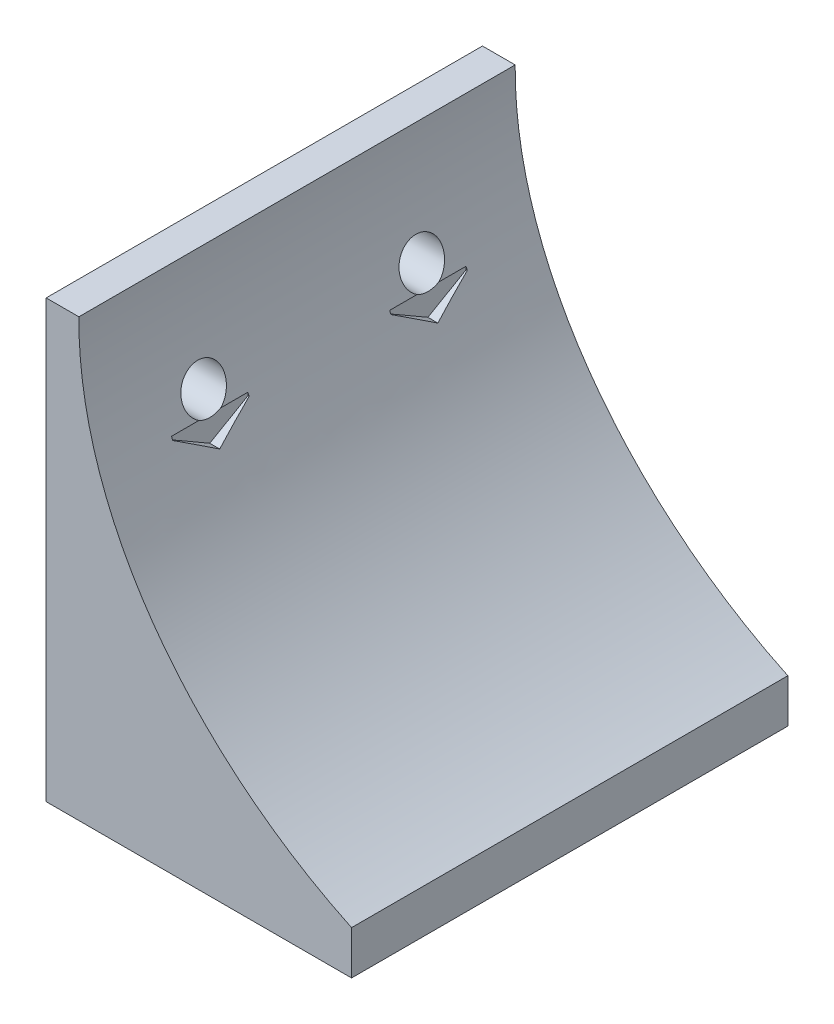
ISO-10303-21;
HEADER;
FILE_DESCRIPTION(('STEP AP214'),'2;1');
FILE_NAME('part.step','',(''),(''),'','','');
FILE_SCHEMA(('AUTOMOTIVE_DESIGN { 1 0 10303 214 1 1 1 1 }'));
ENDSEC;
DATA;
#1=APPLICATION_CONTEXT('core data for automotive mechanical design processes');
#2=APPLICATION_PROTOCOL_DEFINITION('international standard','automotive_design',2000,#1);
#3=PRODUCT_CONTEXT('',#1,'mechanical');
#4=PRODUCT('Part','Part','',(#3));
#5=PRODUCT_RELATED_PRODUCT_CATEGORY('part','',(#4));
#6=PRODUCT_DEFINITION_FORMATION('','',#4);
#7=PRODUCT_DEFINITION_CONTEXT('part definition',#1,'design');
#8=PRODUCT_DEFINITION('design','',#6,#7);
#9=PRODUCT_DEFINITION_SHAPE('','',#8);
#10=(LENGTH_UNIT() NAMED_UNIT(*) SI_UNIT(.MILLI.,.METRE.));
#11=(NAMED_UNIT(*) PLANE_ANGLE_UNIT() SI_UNIT($,.RADIAN.));
#12=(NAMED_UNIT(*) SI_UNIT($,.STERADIAN.) SOLID_ANGLE_UNIT());
#13=UNCERTAINTY_MEASURE_WITH_UNIT(LENGTH_MEASURE(1.E-05),#10,'distance_accuracy_value','');
#14=(GEOMETRIC_REPRESENTATION_CONTEXT(3) GLOBAL_UNCERTAINTY_ASSIGNED_CONTEXT((#13)) GLOBAL_UNIT_ASSIGNED_CONTEXT((#10,
#11,#12)) REPRESENTATION_CONTEXT('',''));
#15=CARTESIAN_POINT('',(0.,0.,0.));
#16=DIRECTION('',(0.,0.,1.));
#17=DIRECTION('',(1.,0.,0.));
#18=AXIS2_PLACEMENT_3D('',#15,#16,#17);
#19=CARTESIAN_POINT('',(28.,4.,20.));
#20=CARTESIAN_POINT('',(14.270416890032,10.4910586185662,20.));
#21=CARTESIAN_POINT('',(2.88730745069731,23.8367436602393,20.));
#22=CARTESIAN_POINT('',(3.,40.,20.));
#23=B_SPLINE_CURVE_WITH_KNOTS('',3,(#19,#20,#21,#22),.UNSPECIFIED.,.F.,.F.,(4,4),(0.,1.),.UNSPECIFIED.);
#24=DIRECTION('',(0.,0.,-1.));
#25=VECTOR('',#24,1.);
#26=SURFACE_OF_LINEAR_EXTRUSION('',#23,#25);
#27=DIRECTION('',(0.,0.,-1.));
#28=VECTOR('',#27,1.);
#29=CARTESIAN_POINT('',(4.99999999999984,28.2646715487179,20.));
#30=LINE('',#29,#28);
#31=CARTESIAN_POINT('',(5.,28.2646715487179,-13.5));
#32=VERTEX_POINT('',#31);
#33=CARTESIAN_POINT('',(5.00000000000479,28.264671548704,-10.9943013457311));
#34=VERTEX_POINT('',#33);
#35=EDGE_CURVE('E57',#32,#34,#30,.F.);
#36=ORIENTED_EDGE('',*,*,#35,.F.);
#37=CARTESIAN_POINT('',(28.,4.,-13.5));
#38=CARTESIAN_POINT('',(14.270416890032,10.4910586185662,-13.5));
#39=CARTESIAN_POINT('',(2.88730745069731,23.8367436602393,-13.5));
#40=CARTESIAN_POINT('',(3.,40.,-13.5));
#41=B_SPLINE_CURVE_WITH_KNOTS('',3,(#37,#38,#39,#40),.UNSPECIFIED.,.F.,.F.,(4,4),(0.,1.),.UNSPECIFIED.);
#42=CARTESIAN_POINT('',(5.10296732017564,27.9792740578363,-13.5));
#43=VERTEX_POINT('',#42);
#44=EDGE_CURVE('E428',#43,#32,#41,.T.);
#45=ORIENTED_EDGE('',*,*,#44,.F.);
#46=CARTESIAN_POINT('',(5.91164645124871,25.9585481156726,-10.));
#47=CARTESIAN_POINT('',(5.86294333406299,26.0704278774324,-10.1937814317066));
#48=CARTESIAN_POINT('',(5.81487322554224,26.1823765111397,-10.3876821531255));
#49=CARTESIAN_POINT('',(5.71999799173363,26.406400385266,-10.7757028852208));
#50=CARTESIAN_POINT('',(5.6731927874347,26.5184756173195,-10.9698228814076));
#51=CARTESIAN_POINT('',(5.58084166284692,26.7427520828007,-11.3582811145629));
#52=CARTESIAN_POINT('',(5.53529570354018,26.8549533122119,-11.5526193445748));
#53=CARTESIAN_POINT('',(5.44545770200272,27.0794811557289,-11.9415129772601));
#54=CARTESIAN_POINT('',(5.40116565933656,27.191807769791,-12.1360683798579));
#55=CARTESIAN_POINT('',(5.31383031622549,27.4165859460474,-12.5253956015665));
#56=CARTESIAN_POINT('',(5.27078705499493,27.5290375120504,-12.7201674272745));
#57=CARTESIAN_POINT('',(5.1859444161202,27.7540651368493,-13.1099267065327));
#58=CARTESIAN_POINT('',(5.14414511598575,27.8666412029513,-13.3049141727375));
#59=CARTESIAN_POINT('',(5.102967319032,27.9792740578363,-13.5));
#60=B_SPLINE_CURVE_WITH_KNOTS('',3,(#46,#47,#48,#49,#50,#51,#52,#53,#54,#55,#56,#57,#58,#59),
.UNSPECIFIED.,.F.,.F.,(4,2,2,2,2,2,4),(0.,0.686994565163245,1.37394611820001,2.06087636204206,
2.74780636733596,3.43475792036626,4.12175218728098),.UNSPECIFIED.);
#61=CARTESIAN_POINT('',(5.91164645124871,25.9585481156726,-10.));
#62=VERTEX_POINT('',#61);
#63=EDGE_CURVE('E289',#62,#43,#60,.T.);
#64=ORIENTED_EDGE('',*,*,#63,.F.);
#65=CARTESIAN_POINT('',(5.10296731903201,27.9792740578363,-6.5));
#66=CARTESIAN_POINT('',(5.14414511598576,27.8666412029513,-6.69508582726245));
#67=CARTESIAN_POINT('',(5.18594441612021,27.7540651368493,-6.89007329346726));
#68=CARTESIAN_POINT('',(5.27078705499493,27.5290375120504,-7.27983257272553));
#69=CARTESIAN_POINT('',(5.31383031622549,27.4165859460474,-7.47460439843347));
#70=CARTESIAN_POINT('',(5.40116565933655,27.191807769791,-7.86393162014208));
#71=CARTESIAN_POINT('',(5.44545770200272,27.0794811557289,-8.05848702273992));
#72=CARTESIAN_POINT('',(5.53529570354018,26.8549533122119,-8.44738065542515));
#73=CARTESIAN_POINT('',(5.58084166284692,26.7427520828007,-8.6417188854371));
#74=CARTESIAN_POINT('',(5.6731927874347,26.5184756173195,-9.03017711859242));
#75=CARTESIAN_POINT('',(5.71999799173362,26.406400385266,-9.22429711477919));
#76=CARTESIAN_POINT('',(5.81487322554224,26.1823765111397,-9.61231784687447));
#77=CARTESIAN_POINT('',(5.86294333406299,26.0704278774324,-9.8062185682934));
#78=CARTESIAN_POINT('',(5.9116464512487,25.9585481156727,-10.));
#79=B_SPLINE_CURVE_WITH_KNOTS('',3,(#65,#66,#67,#68,#69,#70,#71,#72,#73,#74,#75,#76,#77,#78),
.UNSPECIFIED.,.F.,.F.,(4,2,2,2,2,2,4),(0.,0.686994266914724,1.37394581994502,2.06087582523892,
2.74780606908097,3.43475762211773,4.12175218728097),.UNSPECIFIED.);
#80=CARTESIAN_POINT('',(5.10296731903201,27.9792740578363,-6.5));
#81=VERTEX_POINT('',#80);
#82=EDGE_CURVE('E281',#81,#62,#79,.T.);
#83=ORIENTED_EDGE('',*,*,#82,.F.);
#84=CARTESIAN_POINT('',(28.,4.,-6.5));
#85=CARTESIAN_POINT('',(14.270416890032,10.4910586185662,-6.5));
#86=CARTESIAN_POINT('',(2.88730745069731,23.8367436602393,-6.5));
#87=CARTESIAN_POINT('',(3.,40.,-6.5));
#88=B_SPLINE_CURVE_WITH_KNOTS('',3,(#84,#85,#86,#87),.UNSPECIFIED.,.F.,.F.,(4,4),(0.,1.),.UNSPECIFIED.);
#89=CARTESIAN_POINT('',(5.,28.2646715487179,-6.5));
#90=VERTEX_POINT('',#89);
#91=EDGE_CURVE('E414',#90,#81,#88,.F.);
#92=ORIENTED_EDGE('',*,*,#91,.F.);
#93=CARTESIAN_POINT('',(5.,28.2646715487174,-9.0056986542455));
#94=VERTEX_POINT('',#93);
#95=EDGE_CURVE('E213',#94,#90,#30,.F.);
#96=ORIENTED_EDGE('',*,*,#95,.F.);
#97=CARTESIAN_POINT('',(4.43222088083713,30.,-12.));
#98=CARTESIAN_POINT('',(4.44974293299886,29.9413373789127,-12.0000006712431));
#99=CARTESIAN_POINT('',(4.46741739436033,29.8827281275449,-11.9974183191563));
#100=CARTESIAN_POINT('',(4.50294766532626,29.7660102231591,-11.9871287383742));
#101=CARTESIAN_POINT('',(4.52080348586087,29.7079016007078,-11.9794211989681));
#102=CARTESIAN_POINT('',(4.55657593736433,29.5925428051551,-11.9589314987884));
#103=CARTESIAN_POINT('',(4.5744926086243,29.5352934525649,-11.9461447726913));
#104=CARTESIAN_POINT('',(4.61023961368505,29.4220670833317,-11.9155780239674));
#105=CARTESIAN_POINT('',(4.62806984643898,29.3660913597645,-11.8977931517616));
#106=CARTESIAN_POINT('',(4.68115849566962,29.2008265235775,-11.8371350033497));
#107=CARTESIAN_POINT('',(4.71607066886036,29.0940202519856,-11.7869261848609));
#108=CARTESIAN_POINT('',(4.78362670765494,28.890378884824,-11.6681213058975));
#109=CARTESIAN_POINT('',(4.81627107886059,28.7935415643621,-11.5995293605768));
#110=CARTESIAN_POINT('',(4.86230528156323,28.6586727010621,-11.4846827937135));
#111=CARTESIAN_POINT('',(4.87708177974281,28.6156735763312,-11.4446806477219));
#112=CARTESIAN_POINT('',(4.90557919892297,28.533221858793,-11.3608857424979));
#113=CARTESIAN_POINT('',(4.91930109203424,28.4937659940973,-11.3170965551801));
#114=CARTESIAN_POINT('',(4.94553787997058,28.4187114391107,-11.2259733218499));
#115=CARTESIAN_POINT('',(4.95805253476845,28.3831135156956,-11.1786385742072));
#116=CARTESIAN_POINT('',(4.98171168395932,28.3161169674166,-11.0807685600555));
#117=CARTESIAN_POINT('',(4.99285594019665,28.2847190723746,-11.0302327395514));
#118=CARTESIAN_POINT('',(5.02298335858982,28.2001600895797,-10.8794217550344));
#119=CARTESIAN_POINT('',(5.03998511125301,28.1528716587364,-10.7753475120778));
#120=CARTESIAN_POINT('',(5.06752320751768,28.0765927590428,-10.5599657159953));
#121=CARTESIAN_POINT('',(5.07806217417464,28.0475948664622,-10.4486611177714));
#122=CARTESIAN_POINT('',(5.09168896938516,28.0101523526575,-10.2286010755749));
#123=CARTESIAN_POINT('',(5.09515898444773,28.0006532796185,-10.1200487378875));
#124=CARTESIAN_POINT('',(5.09561173203939,27.9994122239561,-9.90284286319394));
#125=CARTESIAN_POINT('',(5.09259567946586,28.0076669158969,-9.79418934894954));
#126=CARTESIAN_POINT('',(5.08040595355075,28.0411502772846,-9.58278419184485));
#127=CARTESIAN_POINT('',(5.07139270906474,28.0659367509291,-9.47995262620488));
#128=CARTESIAN_POINT('',(5.04782530927223,28.1311177435668,-9.28004516309337));
#129=CARTESIAN_POINT('',(5.03327080632882,28.1715132418116,-9.18296962717434));
#130=CARTESIAN_POINT('',(4.99896155416338,28.2674787931369,-8.99515589743125));
#131=CARTESIAN_POINT('',(4.97910946614691,28.323333700223,-8.90458141637141));
#132=CARTESIAN_POINT('',(4.93521498575667,28.4480591759554,-8.73404270437893));
#133=CARTESIAN_POINT('',(4.91117167692207,28.5169325915334,-8.65408080076354));
#134=CARTESIAN_POINT('',(4.85851839238092,28.6695256240102,-8.50267969340601));
#135=CARTESIAN_POINT('',(4.82973821124184,28.7538226733072,-8.43188188388515));
#136=CARTESIAN_POINT('',(4.76966572420325,28.9322451744747,-8.30534046523028));
#137=CARTESIAN_POINT('',(4.73837275487727,29.0263732239118,-8.24960084882639));
#138=CARTESIAN_POINT('',(4.67263782040133,29.22716556535,-8.15180146633445));
#139=CARTESIAN_POINT('',(4.6381167704432,29.3342282950188,-8.11061151057055));
#140=CARTESIAN_POINT('',(4.56858632989384,29.553666964388,-8.04709450695137));
#141=CARTESIAN_POINT('',(4.53357685157585,29.6660438674602,-8.02477089320163));
#142=CARTESIAN_POINT('',(4.46316835846846,29.8962348707765,-7.99925004289926));
#143=CARTESIAN_POINT('',(4.42778465047824,30.0141137215081,-7.99658957016466));
#144=CARTESIAN_POINT('',(4.35863248918182,30.2489878027415,-8.01207261049623));
#145=CARTESIAN_POINT('',(4.32486403563384,30.3659830333756,-8.03021612044822));
#146=CARTESIAN_POINT('',(4.2600816088942,30.5947925967155,-8.08688407169331));
#147=CARTESIAN_POINT('',(4.22904977843526,30.7066378202819,-8.12526286904239));
#148=CARTESIAN_POINT('',(4.17024476968948,30.9225207615271,-8.2215409526029));
#149=CARTESIAN_POINT('',(4.14247107204472,31.0265597225964,-8.27943712196099));
#150=CARTESIAN_POINT('',(4.09160203989925,31.220373569374,-8.41128747486442));
#151=CARTESIAN_POINT('',(4.06839030824124,31.3104855153964,-8.48470102175531));
#152=CARTESIAN_POINT('',(4.02608661085599,31.4771024550081,-8.64661403381712));
#153=CARTESIAN_POINT('',(4.00699381992328,31.5536101735832,-8.73511047084859));
#154=CARTESIAN_POINT('',(3.97385223873481,31.6879734278043,-8.92135547461912));
#155=CARTESIAN_POINT('',(3.9596516059979,31.7463833727393,-9.01867724108158));
#156=CARTESIAN_POINT('',(3.93561675772606,31.8460542067825,-9.2222342906843));
#157=CARTESIAN_POINT('',(3.92578185286967,31.8873178031274,-9.3284681635063));
#158=CARTESIAN_POINT('',(3.91080518252103,31.9504427792697,-9.54387848251632));
#159=CARTESIAN_POINT('',(3.905549190073,31.9727759921927,-9.65290891908874));
#160=CARTESIAN_POINT('',(3.89936767173575,31.9990629272531,-9.87328141606256));
#161=CARTESIAN_POINT('',(3.89844176946189,32.0030182468527,-9.98462327470299));
#162=CARTESIAN_POINT('',(3.90091493047213,31.9924846609868,-10.2050035293794));
#163=CARTESIAN_POINT('',(3.90426098535216,31.9782218138637,-10.3140534180008));
#164=CARTESIAN_POINT('',(3.91514896206928,31.9321104151143,-10.5281471869797));
#165=CARTESIAN_POINT('',(3.92269081581954,31.9002621488534,-10.6331911323136));
#166=CARTESIAN_POINT('',(3.94189321883641,31.8199585013861,-10.8364885398659));
#167=CARTESIAN_POINT('',(3.95355954088226,31.7714798464251,-10.9347322525402));
#168=CARTESIAN_POINT('',(3.98085422561059,31.6594763521875,-11.1216090526023));
#169=CARTESIAN_POINT('',(3.99648261162965,31.5959514242885,-11.2102420833787));
#170=CARTESIAN_POINT('',(4.03172893048728,31.4547982241575,-11.3768275096788));
#171=CARTESIAN_POINT('',(4.05140166802301,31.3769779700585,-11.4546054928943));
#172=CARTESIAN_POINT('',(4.09427061118507,31.2102280004455,-11.5960280919458));
#173=CARTESIAN_POINT('',(4.11746806592065,31.1212943484945,-11.6596676775726));
#174=CARTESIAN_POINT('',(4.16763403699774,30.9323845647681,-11.7728841335369));
#175=CARTESIAN_POINT('',(4.19468816058681,30.8321733878244,-11.8220300391491));
#176=CARTESIAN_POINT('',(4.25148682050204,30.6257424980758,-11.902816440802));
#177=CARTESIAN_POINT('',(4.28122871300179,30.5195287274485,-11.934473925883));
#178=CARTESIAN_POINT('',(4.33133110138029,30.343944157195,-11.9714267396172));
#179=CARTESIAN_POINT('',(4.35108926508236,30.2754880222211,-11.982142570373));
#180=CARTESIAN_POINT('',(4.3912350361631,30.137996676344,-11.996428832027));
#181=CARTESIAN_POINT('',(4.41162264812247,30.0689614612293,-11.9999992109131));
#182=CARTESIAN_POINT('',(4.43222088083713,30.,-12.));
#183=B_SPLINE_CURVE_WITH_KNOTS('',3,(#97,#98,#99,#100,#101,#102,#103,#104,#105,#106,#107,#108,
#109,#110,#111,#112,#113,#114,#115,#116,#117,#118,#119,#120,#121,#122,#123,#124,#125,#126,#127,
#128,#129,#130,#131,#132,#133,#134,#135,#136,#137,#138,#139,#140,#141,#142,#143,#144,#145,#146,
#147,#148,#149,#150,#151,#152,#153,#154,#155,#156,#157,#158,#159,#160,#161,#162,#163,#164,#165,
#166,#167,#168,#169,#170,#171,#172,#173,#174,#175,#176,#177,#178,#179,#180,#181,#182),
.UNSPECIFIED.,.T.,.F.,(4,2,2,2,2,2,2,2,2,2,2,2,2,2,2,2,2,2,2,2,2,2,2,2,2,2,2,2,2,2,2,2,2,2,2,2,
2,2,2,2,2,2,4),(0.,0.183603214365658,0.367217560564521,0.550997319587434,0.734956014949202,
1.10230864549135,1.46957911091546,1.65106413974176,1.83237982185614,2.01373147978411,
2.19511460963043,2.53988460279495,2.88451457114561,3.20995660232482,3.53533768066617,
3.85234688183056,4.16937597419164,4.49268771872,4.81607024813282,5.15592115078042,
5.49586207777958,5.85361483941366,6.21143270621195,6.57898340291806,6.94653404460513,
7.31147463655056,7.67635697639692,8.03016613537876,8.38390434481965,8.72538637215797,
9.06681446239868,9.39945895248506,9.73207452756011,10.0606026878932,10.3891255172298,
10.7181099932874,11.0470964071099,11.3808756568576,11.7147734702679,12.0577795090249,
12.4004517476502,12.6162868663561,12.8321235561319),.UNSPECIFIED.);
#184=EDGE_CURVE('E221',#94,#34,#183,.T.);
#185=ORIENTED_EDGE('',*,*,#184,.T.);
#186=EDGE_LOOP('',(#36,#45,#64,#83,#92,#96,#185));
#187=FACE_BOUND('',#186,.T.);
#188=CARTESIAN_POINT('',(28.,4.,-20.));
#189=CARTESIAN_POINT('',(14.270416890032,10.4910586185662,-20.));
#190=CARTESIAN_POINT('',(2.88730745069731,23.8367436602393,-20.));
#191=CARTESIAN_POINT('',(3.,40.,-20.));
#192=B_SPLINE_CURVE_WITH_KNOTS('',3,(#188,#189,#190,#191),.UNSPECIFIED.,.F.,.F.,(4,4),(0.,1.),.UNSPECIFIED.);
#193=CARTESIAN_POINT('',(28.,4.,-20.));
#194=VERTEX_POINT('',#193);
#195=CARTESIAN_POINT('',(3.,40.,-20.));
#196=VERTEX_POINT('',#195);
#197=EDGE_CURVE('E232',#194,#196,#192,.T.);
#198=ORIENTED_EDGE('',*,*,#197,.T.);
#199=DIRECTION('',(0.,0.,-1.));
#200=VECTOR('',#199,1.);
#201=CARTESIAN_POINT('',(3.,40.,20.));
#202=LINE('',#201,#200);
#203=CARTESIAN_POINT('',(3.,40.,20.));
#204=VERTEX_POINT('',#203);
#205=EDGE_CURVE('E247',#204,#196,#202,.T.);
#206=ORIENTED_EDGE('',*,*,#205,.F.);
#207=CARTESIAN_POINT('',(28.,4.,20.));
#208=VERTEX_POINT('',#207);
#209=EDGE_CURVE('E241',#208,#204,#23,.T.);
#210=ORIENTED_EDGE('',*,*,#209,.F.);
#211=DIRECTION('',(0.,0.,-1.));
#212=VECTOR('',#211,1.);
#213=CARTESIAN_POINT('',(28.,4.,20.));
#214=LINE('',#213,#212);
#215=EDGE_CURVE('E380',#208,#194,#214,.T.);
#216=ORIENTED_EDGE('',*,*,#215,.T.);
#217=EDGE_LOOP('',(#198,#206,#210,#216));
#218=FACE_BOUND('',#217,.T.);
#219=DIRECTION('',(0.,0.,-1.));
#220=VECTOR('',#219,1.);
#221=CARTESIAN_POINT('',(4.99999999999984,28.2646715487179,20.));
#222=LINE('',#221,#220);
#223=CARTESIAN_POINT('',(5.,28.2646715487179,6.50000000000001));
#224=VERTEX_POINT('',#223);
#225=CARTESIAN_POINT('',(4.99999999999999,28.2646715487175,9.00569865424545));
#226=VERTEX_POINT('',#225);
#227=EDGE_CURVE('E65',#224,#226,#222,.F.);
#228=ORIENTED_EDGE('',*,*,#227,.F.);
#229=CARTESIAN_POINT('',(28.,4.,6.50000000000001));
#230=CARTESIAN_POINT('',(14.270416890032,10.4910586185662,6.50000000000001));
#231=CARTESIAN_POINT('',(2.88730745069731,23.8367436602393,6.50000000000001));
#232=CARTESIAN_POINT('',(3.,40.,6.50000000000001));
#233=B_SPLINE_CURVE_WITH_KNOTS('',3,(#229,#230,#231,#232),.UNSPECIFIED.,.F.,.F.,(4,4),(0.,1.),.UNSPECIFIED.);
#234=CARTESIAN_POINT('',(5.10296732017565,27.9792740578363,6.50000000000001));
#235=VERTEX_POINT('',#234);
#236=EDGE_CURVE('E11',#235,#224,#233,.T.);
#237=ORIENTED_EDGE('',*,*,#236,.F.);
#238=CARTESIAN_POINT('',(5.91164645124871,25.9585481156726,10.));
#239=CARTESIAN_POINT('',(5.862943334063,26.0704278774324,9.80621856829341));
#240=CARTESIAN_POINT('',(5.81487322554225,26.1823765111397,9.61231784687448));
#241=CARTESIAN_POINT('',(5.71999799173363,26.406400385266,9.2242971147792));
#242=CARTESIAN_POINT('',(5.67319278743471,26.5184756173195,9.03017711859243));
#243=CARTESIAN_POINT('',(5.58084166284692,26.7427520828007,8.64171888543711));
#244=CARTESIAN_POINT('',(5.53529570354018,26.8549533122119,8.44738065542516));
#245=CARTESIAN_POINT('',(5.44545770200272,27.0794811557289,8.05848702273993));
#246=CARTESIAN_POINT('',(5.40116565933656,27.191807769791,7.86393162014209));
#247=CARTESIAN_POINT('',(5.3138303162255,27.4165859460474,7.47460439843347));
#248=CARTESIAN_POINT('',(5.27078705499493,27.5290375120504,7.27983257272554));
#249=CARTESIAN_POINT('',(5.1859444161202,27.7540651368493,6.89007329346727));
#250=CARTESIAN_POINT('',(5.14414511598575,27.8666412029513,6.69508582726246));
#251=CARTESIAN_POINT('',(5.10296731903201,27.9792740578363,6.50000000000001));
#252=B_SPLINE_CURVE_WITH_KNOTS('',3,(#238,#239,#240,#241,#242,#243,#244,#245,#246,#247,#248,
#249,#250,#251),.UNSPECIFIED.,.F.,.F.,(4,2,2,2,2,2,4),(0.,0.686994565163248,1.37394611820001,
2.06087636204206,2.74780636733596,3.43475792036626,4.12175218728098),.UNSPECIFIED.);
#253=CARTESIAN_POINT('',(5.91164645124871,25.9585481156726,10.));
#254=VERTEX_POINT('',#253);
#255=EDGE_CURVE('E50',#254,#235,#252,.T.);
#256=ORIENTED_EDGE('',*,*,#255,.F.);
#257=CARTESIAN_POINT('',(5.10296731903201,27.9792740578363,13.5));
#258=CARTESIAN_POINT('',(5.14414511598576,27.8666412029513,13.3049141727376));
#259=CARTESIAN_POINT('',(5.18594441612021,27.7540651368493,13.1099267065327));
#260=CARTESIAN_POINT('',(5.27078705499493,27.5290375120504,12.7201674272745));
#261=CARTESIAN_POINT('',(5.3138303162255,27.4165859460474,12.5253956015665));
#262=CARTESIAN_POINT('',(5.40116565933656,27.191807769791,12.1360683798579));
#263=CARTESIAN_POINT('',(5.44545770200272,27.0794811557289,11.9415129772601));
#264=CARTESIAN_POINT('',(5.53529570354018,26.8549533122119,11.5526193445749));
#265=CARTESIAN_POINT('',(5.58084166284692,26.7427520828007,11.3582811145629));
#266=CARTESIAN_POINT('',(5.67319278743471,26.5184756173195,10.9698228814076));
#267=CARTESIAN_POINT('',(5.71999799173363,26.406400385266,10.7757028852208));
#268=CARTESIAN_POINT('',(5.81487322554224,26.1823765111397,10.3876821531255));
#269=CARTESIAN_POINT('',(5.86294333406299,26.0704278774324,10.1937814317066));
#270=CARTESIAN_POINT('',(5.9116464512487,25.9585481156726,9.99999999999999));
#271=B_SPLINE_CURVE_WITH_KNOTS('',3,(#257,#258,#259,#260,#261,#262,#263,#264,#265,#266,#267,
#268,#269,#270),.UNSPECIFIED.,.F.,.F.,(4,2,2,2,2,2,4),(0.,0.686994266914726,1.37394581994502,
2.06087582523892,2.74780606908097,3.43475762211773,4.12175218728098),.UNSPECIFIED.);
#272=CARTESIAN_POINT('',(5.10296731903201,27.9792740578363,13.5));
#273=VERTEX_POINT('',#272);
#274=EDGE_CURVE('E297',#273,#254,#271,.T.);
#275=ORIENTED_EDGE('',*,*,#274,.F.);
#276=CARTESIAN_POINT('',(28.,4.,13.5));
#277=CARTESIAN_POINT('',(14.270416890032,10.4910586185662,13.5));
#278=CARTESIAN_POINT('',(2.88730745069731,23.8367436602393,13.5));
#279=CARTESIAN_POINT('',(3.,40.,13.5));
#280=B_SPLINE_CURVE_WITH_KNOTS('',3,(#276,#277,#278,#279),.UNSPECIFIED.,.F.,.F.,(4,4),(0.,1.),.UNSPECIFIED.);
#281=CARTESIAN_POINT('',(5.,28.2646715487179,13.5));
#282=VERTEX_POINT('',#281);
#283=EDGE_CURVE('E155',#282,#273,#280,.F.);
#284=ORIENTED_EDGE('',*,*,#283,.F.);
#285=CARTESIAN_POINT('',(5.,28.2646715487174,10.9943013457545));
#286=VERTEX_POINT('',#285);
#287=EDGE_CURVE('E160',#286,#282,#222,.F.);
#288=ORIENTED_EDGE('',*,*,#287,.F.);
#289=CARTESIAN_POINT('',(4.43222088083713,30.,8.));
#290=CARTESIAN_POINT('',(4.44974293299886,29.9413373789127,7.99999932875688));
#291=CARTESIAN_POINT('',(4.46741739436033,29.8827281275449,8.00258168084374));
#292=CARTESIAN_POINT('',(4.50294766532626,29.7660102231591,8.01287126162576));
#293=CARTESIAN_POINT('',(4.52080348586087,29.7079016007078,8.02057880103187));
#294=CARTESIAN_POINT('',(4.55657593736433,29.5925428051551,8.04106850121156));
#295=CARTESIAN_POINT('',(4.57449260862431,29.5352934525649,8.05385522730874));
#296=CARTESIAN_POINT('',(4.61023961368505,29.4220670833317,8.08442197603258));
#297=CARTESIAN_POINT('',(4.62806984643898,29.3660913597645,8.1022068482384));
#298=CARTESIAN_POINT('',(4.68115849566961,29.2008265235775,8.16286499665027));
#299=CARTESIAN_POINT('',(4.71607066886035,29.0940202519856,8.21307381513906));
#300=CARTESIAN_POINT('',(4.78362670765494,28.890378884824,8.33187869410248));
#301=CARTESIAN_POINT('',(4.81627107886059,28.7935415643621,8.40047063942315));
#302=CARTESIAN_POINT('',(4.86230528156323,28.6586727010621,8.51531720628648));
#303=CARTESIAN_POINT('',(4.87708177974281,28.6156735763312,8.55531935227804));
#304=CARTESIAN_POINT('',(4.90557919892296,28.533221858793,8.63911425750211));
#305=CARTESIAN_POINT('',(4.91930109203424,28.4937659940974,8.68290344481994));
#306=CARTESIAN_POINT('',(4.94553787997058,28.4187114391107,8.77402667815008));
#307=CARTESIAN_POINT('',(4.95805253476845,28.3831135156956,8.82136142579282));
#308=CARTESIAN_POINT('',(4.98171168395932,28.3161169674166,8.9192314399445));
#309=CARTESIAN_POINT('',(4.99285594019665,28.2847190723746,8.96976726044861));
#310=CARTESIAN_POINT('',(5.02298335858982,28.2001600895797,9.12057824496564));
#311=CARTESIAN_POINT('',(5.03998511125301,28.1528716587364,9.22465248792219));
#312=CARTESIAN_POINT('',(5.06752320751768,28.0765927590428,9.44003428400469));
#313=CARTESIAN_POINT('',(5.07806217417464,28.0475948664622,9.55133888222855));
#314=CARTESIAN_POINT('',(5.09168896938516,28.0101523526575,9.77139892442511));
#315=CARTESIAN_POINT('',(5.09515898444773,28.0006532796185,9.87995126211252));
#316=CARTESIAN_POINT('',(5.09561173203939,27.9994122239561,10.0971571368061));
#317=CARTESIAN_POINT('',(5.09259567946586,28.0076669158968,10.2058106510505));
#318=CARTESIAN_POINT('',(5.08040595355075,28.0411502772846,10.4172158081551));
#319=CARTESIAN_POINT('',(5.07139270906474,28.0659367509291,10.5200473737951));
#320=CARTESIAN_POINT('',(5.04782530927223,28.1311177435668,10.7199548369066));
#321=CARTESIAN_POINT('',(5.03327080632882,28.1715132418116,10.8170303728256));
#322=CARTESIAN_POINT('',(4.99896155416338,28.2674787931369,11.0048441025687));
#323=CARTESIAN_POINT('',(4.97910946614691,28.323333700223,11.0954185836286));
#324=CARTESIAN_POINT('',(4.93521498575668,28.4480591759554,11.2659572956211));
#325=CARTESIAN_POINT('',(4.91117167692207,28.5169325915334,11.3459191992365));
#326=CARTESIAN_POINT('',(4.85851839238093,28.6695256240101,11.497320306594));
#327=CARTESIAN_POINT('',(4.82973821124185,28.7538226733072,11.5681181161148));
#328=CARTESIAN_POINT('',(4.76966572420325,28.9322451744747,11.6946595347697));
#329=CARTESIAN_POINT('',(4.73837275487727,29.0263732239118,11.7503991511736));
#330=CARTESIAN_POINT('',(4.67263782040133,29.22716556535,11.8481985336656));
#331=CARTESIAN_POINT('',(4.63811677044321,29.3342282950188,11.8893884894295));
#332=CARTESIAN_POINT('',(4.56858632989385,29.553666964388,11.9529054930486));
#333=CARTESIAN_POINT('',(4.53357685157586,29.6660438674602,11.9752291067984));
#334=CARTESIAN_POINT('',(4.46316835846847,29.8962348707765,12.0007499571007));
#335=CARTESIAN_POINT('',(4.42778465047824,30.0141137215081,12.0034104298353));
#336=CARTESIAN_POINT('',(4.35863248918183,30.2489878027415,11.9879273895038));
#337=CARTESIAN_POINT('',(4.32486403563384,30.3659830333756,11.9697838795518));
#338=CARTESIAN_POINT('',(4.2600816088942,30.5947925967154,11.9131159283067));
#339=CARTESIAN_POINT('',(4.22904977843526,30.7066378202819,11.8747371309576));
#340=CARTESIAN_POINT('',(4.17024476968948,30.9225207615271,11.7784590473971));
#341=CARTESIAN_POINT('',(4.14247107204472,31.0265597225964,11.720562878039));
#342=CARTESIAN_POINT('',(4.09160203989925,31.220373569374,11.5887125251356));
#343=CARTESIAN_POINT('',(4.06839030824124,31.3104855153964,11.5152989782447));
#344=CARTESIAN_POINT('',(4.02608661085599,31.4771024550081,11.3533859661829));
#345=CARTESIAN_POINT('',(4.00699381992329,31.5536101735832,11.2648895291514));
#346=CARTESIAN_POINT('',(3.97385223873481,31.6879734278043,11.0786445253809));
#347=CARTESIAN_POINT('',(3.9596516059979,31.7463833727393,10.9813227589184));
#348=CARTESIAN_POINT('',(3.93561675772606,31.8460542067825,10.7777657093157));
#349=CARTESIAN_POINT('',(3.92578185286968,31.8873178031274,10.6715318364937));
#350=CARTESIAN_POINT('',(3.91080518252103,31.9504427792697,10.4561215174837));
#351=CARTESIAN_POINT('',(3.905549190073,31.9727759921927,10.3470910809113));
#352=CARTESIAN_POINT('',(3.89936767173575,31.9990629272531,10.1267185839375));
#353=CARTESIAN_POINT('',(3.89844176946189,32.0030182468527,10.015376725297));
#354=CARTESIAN_POINT('',(3.90091493047213,31.9924846609868,9.79499647062061));
#355=CARTESIAN_POINT('',(3.90426098535216,31.9782218138637,9.68594658199918));
#356=CARTESIAN_POINT('',(3.91514896206928,31.9321104151143,9.4718528130203));
#357=CARTESIAN_POINT('',(3.92269081581954,31.9002621488534,9.36680886768644));
#358=CARTESIAN_POINT('',(3.94189321883641,31.8199585013861,9.16351146013407));
#359=CARTESIAN_POINT('',(3.95355954088226,31.7714798464251,9.06526774745977));
#360=CARTESIAN_POINT('',(3.98085422561059,31.6594763521875,8.8783909473977));
#361=CARTESIAN_POINT('',(3.99648261162964,31.5959514242885,8.78975791662127));
#362=CARTESIAN_POINT('',(4.03172893048728,31.4547982241575,8.62317249032119));
#363=CARTESIAN_POINT('',(4.05140166802301,31.3769779700585,8.54539450710572));
#364=CARTESIAN_POINT('',(4.09427061118507,31.2102280004455,8.40397190805422));
#365=CARTESIAN_POINT('',(4.11746806592065,31.1212943484945,8.34033232242744));
#366=CARTESIAN_POINT('',(4.16763403699774,30.9323845647681,8.22711586646311));
#367=CARTESIAN_POINT('',(4.19468816058681,30.8321733878244,8.17796996085093));
#368=CARTESIAN_POINT('',(4.25148682050203,30.6257424980758,8.09718355919802));
#369=CARTESIAN_POINT('',(4.28122871300179,30.5195287274485,8.06552607411702));
#370=CARTESIAN_POINT('',(4.33133110138029,30.343944157195,8.02857326038277));
#371=CARTESIAN_POINT('',(4.35108926508236,30.2754880222211,8.01785742962696));
#372=CARTESIAN_POINT('',(4.3912350361631,30.137996676344,8.00357116797295));
#373=CARTESIAN_POINT('',(4.41162264812247,30.0689614612293,8.0000007890869));
#374=CARTESIAN_POINT('',(4.43222088083713,30.,8.));
#375=B_SPLINE_CURVE_WITH_KNOTS('',3,(#289,#290,#291,#292,#293,#294,#295,#296,#297,#298,#299,
#300,#301,#302,#303,#304,#305,#306,#307,#308,#309,#310,#311,#312,#313,#314,#315,#316,#317,#318,
#319,#320,#321,#322,#323,#324,#325,#326,#327,#328,#329,#330,#331,#332,#333,#334,#335,#336,#337,
#338,#339,#340,#341,#342,#343,#344,#345,#346,#347,#348,#349,#350,#351,#352,#353,#354,#355,#356,
#357,#358,#359,#360,#361,#362,#363,#364,#365,#366,#367,#368,#369,#370,#371,#372,#373,#374),
.UNSPECIFIED.,.T.,.F.,(4,2,2,2,2,2,2,2,2,2,2,2,2,2,2,2,2,2,2,2,2,2,2,2,2,2,2,2,2,2,2,2,2,2,2,2,
2,2,2,2,2,2,4),(0.,0.183603214365658,0.367217560564517,0.550997319587431,0.734956014949197,
1.10230864549134,1.46957911091545,1.65106413974174,1.83237982185613,2.01373147978411,
2.19511460963043,2.53988460279494,2.8845145711456,3.20995660232481,3.53533768066616,
3.85234688183055,4.16937597419163,4.49268771871999,4.81607024813281,5.15592115078041,
5.49586207777957,5.85361483941365,6.21143270621194,6.57898340291805,6.94653404460512,
7.31147463655056,7.67635697639692,8.03016613537875,8.38390434481965,8.72538637215797,
9.06681446239867,9.39945895248505,9.7320745275601,10.0606026878932,10.3891255172298,
10.7181099932874,11.0470964071099,11.3808756568576,11.7147734702679,12.0577795090249,
12.4004517476502,12.6162868663561,12.8321235561319),.UNSPECIFIED.);
#376=EDGE_CURVE('E220',#286,#226,#375,.T.);
#377=ORIENTED_EDGE('',*,*,#376,.T.);
#378=EDGE_LOOP('',(#228,#237,#256,#275,#284,#288,#377));
#379=FACE_BOUND('',#378,.T.);
#380=ADVANCED_FACE('F39',(#187,#218,#379),#26,.F.);
#381=CARTESIAN_POINT('',(-10.,30.,-10.));
#382=DIRECTION('',(1.,0.,0.));
#383=DIRECTION('',(0.,0.,-1.));
#384=AXIS2_PLACEMENT_3D('',#381,#382,#383);
#385=CYLINDRICAL_SURFACE('',#384,2.);
#386=CARTESIAN_POINT('',(0.,30.,-10.));
#387=DIRECTION('',(1.,0.,0.));
#388=DIRECTION('',(0.,1.,0.));
#389=AXIS2_PLACEMENT_3D('',#386,#387,#388);
#390=CIRCLE('',#389,2.);
#391=CARTESIAN_POINT('',(0.,32.,-10.));
#392=VERTEX_POINT('',#391);
#393=EDGE_CURVE('E216',#392,#392,#390,.T.);
#394=ORIENTED_EDGE('',*,*,#393,.F.);
#395=EDGE_LOOP('',(#394));
#396=FACE_BOUND('',#395,.T.);
#397=CARTESIAN_POINT('',(5.,30.,-10.));
#398=DIRECTION('',(1.,0.,0.));
#399=DIRECTION('',(0.,0.,-1.));
#400=AXIS2_PLACEMENT_3D('',#397,#398,#399);
#401=CIRCLE('',#400,2.);
#402=EDGE_CURVE('E372',#34,#94,#401,.F.);
#403=ORIENTED_EDGE('',*,*,#402,.F.);
#404=ORIENTED_EDGE('',*,*,#184,.F.);
#405=EDGE_LOOP('',(#403,#404));
#406=FACE_BOUND('',#405,.T.);
#407=ADVANCED_FACE('F257',(#396,#406),#385,.F.);
#408=CARTESIAN_POINT('',(-10.,30.,10.));
#409=DIRECTION('',(1.,0.,0.));
#410=DIRECTION('',(0.,0.,-1.));
#411=AXIS2_PLACEMENT_3D('',#408,#409,#410);
#412=CYLINDRICAL_SURFACE('',#411,2.);
#413=CARTESIAN_POINT('',(0.,30.,10.));
#414=DIRECTION('',(1.,0.,0.));
#415=DIRECTION('',(0.,1.,0.));
#416=AXIS2_PLACEMENT_3D('',#413,#414,#415);
#417=CIRCLE('',#416,2.);
#418=CARTESIAN_POINT('',(0.,32.,10.));
#419=VERTEX_POINT('',#418);
#420=EDGE_CURVE('E222',#419,#419,#417,.T.);
#421=ORIENTED_EDGE('',*,*,#420,.F.);
#422=EDGE_LOOP('',(#421));
#423=FACE_BOUND('',#422,.T.);
#424=CARTESIAN_POINT('',(5.,30.,10.));
#425=DIRECTION('',(1.,0.,0.));
#426=DIRECTION('',(0.,0.,-1.));
#427=AXIS2_PLACEMENT_3D('',#424,#425,#426);
#428=CIRCLE('',#427,2.);
#429=EDGE_CURVE('E368',#226,#286,#428,.F.);
#430=ORIENTED_EDGE('',*,*,#429,.F.);
#431=ORIENTED_EDGE('',*,*,#376,.F.);
#432=EDGE_LOOP('',(#430,#431));
#433=FACE_BOUND('',#432,.T.);
#434=ADVANCED_FACE('F338',(#423,#433),#412,.F.);
#435=CARTESIAN_POINT('',(0.,40.,20.));
#436=DIRECTION('',(0.,-1.,0.));
#437=DIRECTION('',(1.,0.,0.));
#438=AXIS2_PLACEMENT_3D('',#435,#436,#437);
#439=PLANE('',#438);
#440=DIRECTION('',(-1.,0.,0.));
#441=VECTOR('',#440,1.);
#442=CARTESIAN_POINT('',(0.,40.,-20.));
#443=LINE('',#442,#441);
#444=CARTESIAN_POINT('',(0.,40.,-20.));
#445=VERTEX_POINT('',#444);
#446=EDGE_CURVE('E226',#196,#445,#443,.T.);
#447=ORIENTED_EDGE('',*,*,#446,.T.);
#448=DIRECTION('',(0.,0.,-1.));
#449=VECTOR('',#448,1.);
#450=CARTESIAN_POINT('',(0.,40.,20.));
#451=LINE('',#450,#449);
#452=CARTESIAN_POINT('',(0.,40.,20.));
#453=VERTEX_POINT('',#452);
#454=EDGE_CURVE('E364',#453,#445,#451,.T.);
#455=ORIENTED_EDGE('',*,*,#454,.F.);
#456=DIRECTION('',(-1.,0.,0.));
#457=VECTOR('',#456,1.);
#458=CARTESIAN_POINT('',(0.,40.,20.));
#459=LINE('',#458,#457);
#460=EDGE_CURVE('E227',#204,#453,#459,.T.);
#461=ORIENTED_EDGE('',*,*,#460,.F.);
#462=ORIENTED_EDGE('',*,*,#205,.T.);
#463=EDGE_LOOP('',(#447,#455,#461,#462));
#464=FACE_BOUND('',#463,.T.);
#465=ADVANCED_FACE('F41',(#464),#439,.F.);
#466=CARTESIAN_POINT('',(0.,40.,20.));
#467=DIRECTION('',(1.,0.,0.));
#468=DIRECTION('',(0.,1.,0.));
#469=AXIS2_PLACEMENT_3D('',#466,#467,#468);
#470=PLANE('',#469);
#471=ORIENTED_EDGE('',*,*,#420,.T.);
#472=EDGE_LOOP('',(#471));
#473=FACE_BOUND('',#472,.T.);
#474=ORIENTED_EDGE('',*,*,#393,.T.);
#475=EDGE_LOOP('',(#474));
#476=FACE_BOUND('',#475,.T.);
#477=DIRECTION('',(0.,-1.,0.));
#478=VECTOR('',#477,1.);
#479=CARTESIAN_POINT('',(0.,40.,-20.));
#480=LINE('',#479,#478);
#481=CARTESIAN_POINT('',(0.,0.,-20.));
#482=VERTEX_POINT('',#481);
#483=EDGE_CURVE('E398',#445,#482,#480,.T.);
#484=ORIENTED_EDGE('',*,*,#483,.T.);
#485=DIRECTION('',(0.,0.,-1.));
#486=VECTOR('',#485,1.);
#487=CARTESIAN_POINT('',(0.,0.,20.));
#488=LINE('',#487,#486);
#489=CARTESIAN_POINT('',(0.,0.,20.));
#490=VERTEX_POINT('',#489);
#491=EDGE_CURVE('E369',#490,#482,#488,.T.);
#492=ORIENTED_EDGE('',*,*,#491,.F.);
#493=DIRECTION('',(0.,-1.,0.));
#494=VECTOR('',#493,1.);
#495=CARTESIAN_POINT('',(0.,40.,20.));
#496=LINE('',#495,#494);
#497=EDGE_CURVE('E231',#453,#490,#496,.T.);
#498=ORIENTED_EDGE('',*,*,#497,.F.);
#499=ORIENTED_EDGE('',*,*,#454,.T.);
#500=EDGE_LOOP('',(#484,#492,#498,#499));
#501=FACE_BOUND('',#500,.T.);
#502=ADVANCED_FACE('F480',(#473,#476,#501),#470,.F.);
#503=CARTESIAN_POINT('',(0.,0.,20.));
#504=DIRECTION('',(0.,1.,0.));
#505=DIRECTION('',(0.,0.,1.));
#506=AXIS2_PLACEMENT_3D('',#503,#504,#505);
#507=PLANE('',#506);
#508=DIRECTION('',(1.,0.,0.));
#509=VECTOR('',#508,1.);
#510=CARTESIAN_POINT('',(0.,0.,-20.));
#511=LINE('',#510,#509);
#512=CARTESIAN_POINT('',(28.,0.,-20.));
#513=VERTEX_POINT('',#512);
#514=EDGE_CURVE('E396',#482,#513,#511,.T.);
#515=ORIENTED_EDGE('',*,*,#514,.T.);
#516=DIRECTION('',(0.,0.,-1.));
#517=VECTOR('',#516,1.);
#518=CARTESIAN_POINT('',(28.,0.,20.));
#519=LINE('',#518,#517);
#520=CARTESIAN_POINT('',(28.,0.,20.));
#521=VERTEX_POINT('',#520);
#522=EDGE_CURVE('E374',#521,#513,#519,.T.);
#523=ORIENTED_EDGE('',*,*,#522,.F.);
#524=DIRECTION('',(1.,0.,0.));
#525=VECTOR('',#524,1.);
#526=CARTESIAN_POINT('',(0.,0.,20.));
#527=LINE('',#526,#525);
#528=EDGE_CURVE('E235',#490,#521,#527,.T.);
#529=ORIENTED_EDGE('',*,*,#528,.F.);
#530=ORIENTED_EDGE('',*,*,#491,.T.);
#531=EDGE_LOOP('',(#515,#523,#529,#530));
#532=FACE_BOUND('',#531,.T.);
#533=ADVANCED_FACE('F353',(#532),#507,.F.);
#534=CARTESIAN_POINT('',(28.,0.,20.));
#535=DIRECTION('',(-1.,0.,0.));
#536=DIRECTION('',(0.,0.,1.));
#537=AXIS2_PLACEMENT_3D('',#534,#535,#536);
#538=PLANE('',#537);
#539=DIRECTION('',(0.,1.,0.));
#540=VECTOR('',#539,1.);
#541=CARTESIAN_POINT('',(28.,0.,-20.));
#542=LINE('',#541,#540);
#543=EDGE_CURVE('E390',#513,#194,#542,.T.);
#544=ORIENTED_EDGE('',*,*,#543,.T.);
#545=ORIENTED_EDGE('',*,*,#215,.F.);
#546=DIRECTION('',(0.,1.,0.));
#547=VECTOR('',#546,1.);
#548=CARTESIAN_POINT('',(28.,0.,20.));
#549=LINE('',#548,#547);
#550=EDGE_CURVE('E238',#521,#208,#549,.T.);
#551=ORIENTED_EDGE('',*,*,#550,.F.);
#552=ORIENTED_EDGE('',*,*,#522,.T.);
#553=EDGE_LOOP('',(#544,#545,#551,#552));
#554=FACE_BOUND('',#553,.T.);
#555=ADVANCED_FACE('F261',(#554),#538,.F.);
#556=CARTESIAN_POINT('',(10.3091466277735,18.372925854552,20.));
#557=DIRECTION('',(0.,0.,1.));
#558=DIRECTION('',(1.,0.,0.));
#559=AXIS2_PLACEMENT_3D('',#556,#557,#558);
#560=PLANE('',#559);
#561=ORIENTED_EDGE('',*,*,#460,.T.);
#562=ORIENTED_EDGE('',*,*,#497,.T.);
#563=ORIENTED_EDGE('',*,*,#528,.T.);
#564=ORIENTED_EDGE('',*,*,#550,.T.);
#565=ORIENTED_EDGE('',*,*,#209,.T.);
#566=EDGE_LOOP('',(#561,#562,#563,#564,#565));
#567=FACE_BOUND('',#566,.T.);
#568=ADVANCED_FACE('F345',(#567),#560,.T.);
#569=CARTESIAN_POINT('',(10.3091466277735,18.372925854552,-20.));
#570=DIRECTION('',(0.,0.,1.));
#571=DIRECTION('',(1.,0.,0.));
#572=AXIS2_PLACEMENT_3D('',#569,#570,#571);
#573=PLANE('',#572);
#574=ORIENTED_EDGE('',*,*,#446,.F.);
#575=ORIENTED_EDGE('',*,*,#197,.F.);
#576=ORIENTED_EDGE('',*,*,#543,.F.);
#577=ORIENTED_EDGE('',*,*,#514,.F.);
#578=ORIENTED_EDGE('',*,*,#483,.F.);
#579=EDGE_LOOP('',(#574,#575,#576,#577,#578));
#580=FACE_BOUND('',#579,.T.);
#581=ADVANCED_FACE('F259',(#580),#573,.F.);
#582=CARTESIAN_POINT('',(25.,32.0207259421637,13.5));
#583=DIRECTION('',(0.,0.,-1.));
#584=DIRECTION('',(-1.,0.,0.));
#585=AXIS2_PLACEMENT_3D('',#582,#583,#584);
#586=PLANE('',#585);
#587=ORIENTED_EDGE('',*,*,#283,.T.);
#588=DIRECTION('',(-1.,0.,0.));
#589=VECTOR('',#588,1.);
#590=CARTESIAN_POINT('',(25.,27.9792740578363,13.5));
#591=LINE('',#590,#589);
#592=CARTESIAN_POINT('',(5.,27.9792740578363,13.5));
#593=VERTEX_POINT('',#592);
#594=EDGE_CURVE('E150',#273,#593,#591,.T.);
#595=ORIENTED_EDGE('',*,*,#594,.T.);
#596=DIRECTION('',(0.,-1.,0.));
#597=VECTOR('',#596,1.);
#598=CARTESIAN_POINT('',(5.,32.0207259421637,13.5));
#599=LINE('',#598,#597);
#600=EDGE_CURVE('E153',#282,#593,#599,.T.);
#601=ORIENTED_EDGE('',*,*,#600,.F.);
#602=EDGE_LOOP('',(#587,#595,#601));
#603=FACE_BOUND('',#602,.T.);
#604=ADVANCED_FACE('F152',(#603),#586,.T.);
#605=CARTESIAN_POINT('',(25.,27.9792740578363,13.5));
#606=DIRECTION('',(0.,0.866025403784439,-0.5));
#607=DIRECTION('',(0.,0.5,0.866025403784439));
#608=AXIS2_PLACEMENT_3D('',#605,#606,#607);
#609=PLANE('',#608);
#610=ORIENTED_EDGE('',*,*,#274,.T.);
#611=DIRECTION('',(-1.,0.,0.));
#612=VECTOR('',#611,1.);
#613=CARTESIAN_POINT('',(25.,25.9585481156726,10.));
#614=LINE('',#613,#612);
#615=CARTESIAN_POINT('',(5.,25.9585481156726,10.));
#616=VERTEX_POINT('',#615);
#617=EDGE_CURVE('E161',#254,#616,#614,.T.);
#618=ORIENTED_EDGE('',*,*,#617,.T.);
#619=DIRECTION('',(0.,-0.5,-0.866025403784439));
#620=VECTOR('',#619,1.);
#621=CARTESIAN_POINT('',(5.,27.9792740578363,13.5));
#622=LINE('',#621,#620);
#623=EDGE_CURVE('E166',#593,#616,#622,.T.);
#624=ORIENTED_EDGE('',*,*,#623,.F.);
#625=ORIENTED_EDGE('',*,*,#594,.F.);
#626=EDGE_LOOP('',(#610,#618,#624,#625));
#627=FACE_BOUND('',#626,.T.);
#628=ADVANCED_FACE('F172',(#627),#609,.T.);
#629=CARTESIAN_POINT('',(25.,25.9585481156726,10.));
#630=DIRECTION('',(0.,0.866025403784439,0.5));
#631=DIRECTION('',(0.,-0.5,0.866025403784439));
#632=AXIS2_PLACEMENT_3D('',#629,#630,#631);
#633=PLANE('',#632);
#634=ORIENTED_EDGE('',*,*,#255,.T.);
#635=DIRECTION('',(-1.,0.,0.));
#636=VECTOR('',#635,1.);
#637=CARTESIAN_POINT('',(25.,27.9792740578363,6.50000000000001));
#638=LINE('',#637,#636);
#639=CARTESIAN_POINT('',(5.,27.9792740578363,6.50000000000001));
#640=VERTEX_POINT('',#639);
#641=EDGE_CURVE('E183',#235,#640,#638,.T.);
#642=ORIENTED_EDGE('',*,*,#641,.T.);
#643=DIRECTION('',(0.,0.5,-0.866025403784439));
#644=VECTOR('',#643,1.);
#645=CARTESIAN_POINT('',(5.,25.9585481156726,10.));
#646=LINE('',#645,#644);
#647=EDGE_CURVE('E175',#616,#640,#646,.T.);
#648=ORIENTED_EDGE('',*,*,#647,.F.);
#649=ORIENTED_EDGE('',*,*,#617,.F.);
#650=EDGE_LOOP('',(#634,#642,#648,#649));
#651=FACE_BOUND('',#650,.T.);
#652=ADVANCED_FACE('F315',(#651),#633,.T.);
#653=CARTESIAN_POINT('',(25.,27.9792740578363,6.50000000000001));
#654=DIRECTION('',(0.,0.,1.));
#655=DIRECTION('',(1.,0.,0.));
#656=AXIS2_PLACEMENT_3D('',#653,#654,#655);
#657=PLANE('',#656);
#658=ORIENTED_EDGE('',*,*,#236,.T.);
#659=DIRECTION('',(0.,1.,0.));
#660=VECTOR('',#659,1.);
#661=CARTESIAN_POINT('',(5.,27.9792740578363,6.50000000000001));
#662=LINE('',#661,#660);
#663=EDGE_CURVE('E178',#640,#224,#662,.T.);
#664=ORIENTED_EDGE('',*,*,#663,.F.);
#665=ORIENTED_EDGE('',*,*,#641,.F.);
#666=EDGE_LOOP('',(#658,#664,#665));
#667=FACE_BOUND('',#666,.T.);
#668=ADVANCED_FACE('F447',(#667),#657,.T.);
#669=CARTESIAN_POINT('',(5.,0.,0.));
#670=DIRECTION('',(1.,0.,0.));
#671=DIRECTION('',(0.,0.,-1.));
#672=AXIS2_PLACEMENT_3D('',#669,#670,#671);
#673=PLANE('',#672);
#674=ORIENTED_EDGE('',*,*,#227,.T.);
#675=ORIENTED_EDGE('',*,*,#429,.T.);
#676=ORIENTED_EDGE('',*,*,#287,.T.);
#677=ORIENTED_EDGE('',*,*,#600,.T.);
#678=ORIENTED_EDGE('',*,*,#623,.T.);
#679=ORIENTED_EDGE('',*,*,#647,.T.);
#680=ORIENTED_EDGE('',*,*,#663,.T.);
#681=EDGE_LOOP('',(#674,#675,#676,#677,#678,#679,#680));
#682=FACE_BOUND('',#681,.T.);
#683=ADVANCED_FACE('F164',(#682),#673,.T.);
#684=CARTESIAN_POINT('',(25.,32.0207259421637,-6.5));
#685=DIRECTION('',(0.,0.,-1.));
#686=DIRECTION('',(0.,1.,0.));
#687=AXIS2_PLACEMENT_3D('',#684,#685,#686);
#688=PLANE('',#687);
#689=ORIENTED_EDGE('',*,*,#91,.T.);
#690=DIRECTION('',(-1.,0.,0.));
#691=VECTOR('',#690,1.);
#692=CARTESIAN_POINT('',(25.,27.9792740578363,-6.5));
#693=LINE('',#692,#691);
#694=CARTESIAN_POINT('',(5.,27.9792740578363,-6.5));
#695=VERTEX_POINT('',#694);
#696=EDGE_CURVE('E170',#81,#695,#693,.T.);
#697=ORIENTED_EDGE('',*,*,#696,.T.);
#698=DIRECTION('',(0.,-1.,0.));
#699=VECTOR('',#698,1.);
#700=CARTESIAN_POINT('',(5.,32.0207259421637,-6.5));
#701=LINE('',#700,#699);
#702=EDGE_CURVE('E188',#90,#695,#701,.T.);
#703=ORIENTED_EDGE('',*,*,#702,.F.);
#704=EDGE_LOOP('',(#689,#697,#703));
#705=FACE_BOUND('',#704,.T.);
#706=ADVANCED_FACE('F334',(#705),#688,.T.);
#707=CARTESIAN_POINT('',(25.,27.9792740578363,-6.5));
#708=DIRECTION('',(0.,0.866025403784438,-0.5));
#709=DIRECTION('',(0.,0.5,0.866025403784438));
#710=AXIS2_PLACEMENT_3D('',#707,#708,#709);
#711=PLANE('',#710);
#712=ORIENTED_EDGE('',*,*,#82,.T.);
#713=DIRECTION('',(-1.,0.,0.));
#714=VECTOR('',#713,1.);
#715=CARTESIAN_POINT('',(25.,25.9585481156726,-10.));
#716=LINE('',#715,#714);
#717=CARTESIAN_POINT('',(5.,25.9585481156726,-10.));
#718=VERTEX_POINT('',#717);
#719=EDGE_CURVE('E206',#62,#718,#716,.T.);
#720=ORIENTED_EDGE('',*,*,#719,.T.);
#721=DIRECTION('',(0.,-0.5,-0.866025403784438));
#722=VECTOR('',#721,1.);
#723=CARTESIAN_POINT('',(5.,27.9792740578363,-6.5));
#724=LINE('',#723,#722);
#725=EDGE_CURVE('E192',#695,#718,#724,.T.);
#726=ORIENTED_EDGE('',*,*,#725,.F.);
#727=ORIENTED_EDGE('',*,*,#696,.F.);
#728=EDGE_LOOP('',(#712,#720,#726,#727));
#729=FACE_BOUND('',#728,.T.);
#730=ADVANCED_FACE('F329',(#729),#711,.T.);
#731=CARTESIAN_POINT('',(25.,25.9585481156726,-10.));
#732=DIRECTION('',(0.,0.866025403784438,0.500000000000001));
#733=DIRECTION('',(0.,-0.500000000000001,0.866025403784438));
#734=AXIS2_PLACEMENT_3D('',#731,#732,#733);
#735=PLANE('',#734);
#736=ORIENTED_EDGE('',*,*,#63,.T.);
#737=DIRECTION('',(-1.,0.,0.));
#738=VECTOR('',#737,1.);
#739=CARTESIAN_POINT('',(25.,27.9792740578363,-13.5));
#740=LINE('',#739,#738);
#741=CARTESIAN_POINT('',(5.,27.9792740578363,-13.5));
#742=VERTEX_POINT('',#741);
#743=EDGE_CURVE('E203',#43,#742,#740,.T.);
#744=ORIENTED_EDGE('',*,*,#743,.T.);
#745=DIRECTION('',(0.,0.500000000000001,-0.866025403784438));
#746=VECTOR('',#745,1.);
#747=CARTESIAN_POINT('',(5.,25.9585481156726,-10.));
#748=LINE('',#747,#746);
#749=EDGE_CURVE('E196',#718,#742,#748,.T.);
#750=ORIENTED_EDGE('',*,*,#749,.F.);
#751=ORIENTED_EDGE('',*,*,#719,.F.);
#752=EDGE_LOOP('',(#736,#744,#750,#751));
#753=FACE_BOUND('',#752,.T.);
#754=ADVANCED_FACE('F325',(#753),#735,.T.);
#755=CARTESIAN_POINT('',(25.,27.9792740578363,-13.5));
#756=DIRECTION('',(0.,0.,1.));
#757=DIRECTION('',(0.,-1.,0.));
#758=AXIS2_PLACEMENT_3D('',#755,#756,#757);
#759=PLANE('',#758);
#760=ORIENTED_EDGE('',*,*,#44,.T.);
#761=DIRECTION('',(0.,1.,0.));
#762=VECTOR('',#761,1.);
#763=CARTESIAN_POINT('',(5.,27.9792740578363,-13.5));
#764=LINE('',#763,#762);
#765=EDGE_CURVE('E200',#742,#32,#764,.T.);
#766=ORIENTED_EDGE('',*,*,#765,.F.);
#767=ORIENTED_EDGE('',*,*,#743,.F.);
#768=EDGE_LOOP('',(#760,#766,#767));
#769=FACE_BOUND('',#768,.T.);
#770=ADVANCED_FACE('F323',(#769),#759,.T.);
#771=CARTESIAN_POINT('',(5.,0.,0.));
#772=DIRECTION('',(1.,0.,0.));
#773=DIRECTION('',(0.,0.,-1.));
#774=AXIS2_PLACEMENT_3D('',#771,#772,#773);
#775=PLANE('',#774);
#776=ORIENTED_EDGE('',*,*,#35,.T.);
#777=ORIENTED_EDGE('',*,*,#402,.T.);
#778=ORIENTED_EDGE('',*,*,#95,.T.);
#779=ORIENTED_EDGE('',*,*,#702,.T.);
#780=ORIENTED_EDGE('',*,*,#725,.T.);
#781=ORIENTED_EDGE('',*,*,#749,.T.);
#782=ORIENTED_EDGE('',*,*,#765,.T.);
#783=EDGE_LOOP('',(#776,#777,#778,#779,#780,#781,#782));
#784=FACE_BOUND('',#783,.T.);
#785=ADVANCED_FACE('F320',(#784),#775,.T.);
#786=CLOSED_SHELL('',(#380,#407,#434,#465,#502,#533,#555,#568,#581,#604,#628,#652,#668,#683,
#706,#730,#754,#770,#785));
#787=MANIFOLD_SOLID_BREP('B2',#786);
#788=ADVANCED_BREP_SHAPE_REPRESENTATION('',(#18,#787),#14);
#789=SHAPE_DEFINITION_REPRESENTATION(#9,#788);
ENDSEC;
END-ISO-10303-21;
